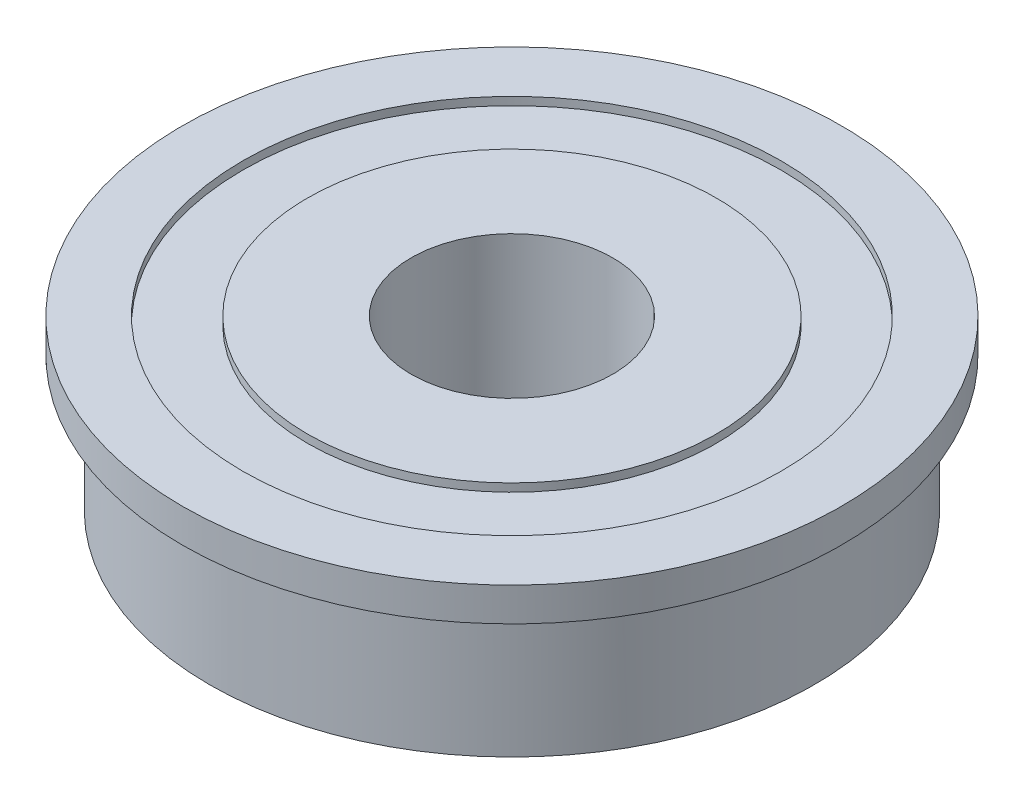
ISO-10303-21;
HEADER;
FILE_DESCRIPTION(('STEP AP214'),'2;1');
FILE_NAME('part.step','',(''),(''),'','','');
FILE_SCHEMA(('AUTOMOTIVE_DESIGN { 1 0 10303 214 1 1 1 1 }'));
ENDSEC;
DATA;
#1=APPLICATION_CONTEXT('core data for automotive mechanical design processes');
#2=APPLICATION_PROTOCOL_DEFINITION('international standard','automotive_design',2000,#1);
#3=PRODUCT_CONTEXT('',#1,'mechanical');
#4=PRODUCT('Part','Part','',(#3));
#5=PRODUCT_RELATED_PRODUCT_CATEGORY('part','',(#4));
#6=PRODUCT_DEFINITION_FORMATION('','',#4);
#7=PRODUCT_DEFINITION_CONTEXT('part definition',#1,'design');
#8=PRODUCT_DEFINITION('design','',#6,#7);
#9=PRODUCT_DEFINITION_SHAPE('','',#8);
#10=(LENGTH_UNIT() NAMED_UNIT(*) SI_UNIT(.MILLI.,.METRE.));
#11=(NAMED_UNIT(*) PLANE_ANGLE_UNIT() SI_UNIT($,.RADIAN.));
#12=(NAMED_UNIT(*) SI_UNIT($,.STERADIAN.) SOLID_ANGLE_UNIT());
#13=UNCERTAINTY_MEASURE_WITH_UNIT(LENGTH_MEASURE(1.E-05),#10,'distance_accuracy_value','');
#14=(GEOMETRIC_REPRESENTATION_CONTEXT(3) GLOBAL_UNCERTAINTY_ASSIGNED_CONTEXT((#13)) GLOBAL_UNIT_ASSIGNED_CONTEXT((#10,
#11,#12)) REPRESENTATION_CONTEXT('',''));
#15=CARTESIAN_POINT('',(0.,0.,0.));
#16=DIRECTION('',(0.,0.,1.));
#17=DIRECTION('',(1.,0.,0.));
#18=AXIS2_PLACEMENT_3D('',#15,#16,#17);
#19=CARTESIAN_POINT('',(0.,0.,0.));
#20=DIRECTION('',(0.,1.,0.));
#21=DIRECTION('',(0.,0.,1.));
#22=AXIS2_PLACEMENT_3D('',#19,#20,#21);
#23=CYLINDRICAL_SURFACE('',#22,12.7);
#24=CARTESIAN_POINT('',(0.,0.381,0.));
#25=DIRECTION('',(0.,1.,0.));
#26=DIRECTION('',(0.,0.,1.));
#27=AXIS2_PLACEMENT_3D('',#24,#25,#26);
#28=CIRCLE('',#27,12.7);
#29=CARTESIAN_POINT('',(0.,0.381,12.7));
#30=VERTEX_POINT('',#29);
#31=EDGE_CURVE('E137',#30,#30,#28,.F.);
#32=ORIENTED_EDGE('',*,*,#31,.F.);
#33=EDGE_LOOP('',(#32));
#34=FACE_BOUND('',#33,.T.);
#35=CARTESIAN_POINT('',(0.,0.,0.));
#36=DIRECTION('',(0.,1.,0.));
#37=DIRECTION('',(0.,0.,1.));
#38=AXIS2_PLACEMENT_3D('',#35,#36,#37);
#39=CIRCLE('',#38,12.7);
#40=CARTESIAN_POINT('',(0.,0.,12.7));
#41=VERTEX_POINT('',#40);
#42=EDGE_CURVE('E135',#41,#41,#39,.T.);
#43=ORIENTED_EDGE('',*,*,#42,.F.);
#44=EDGE_LOOP('',(#43));
#45=FACE_BOUND('',#44,.T.);
#46=ADVANCED_FACE('F38',(#34,#45),#23,.F.);
#47=CARTESIAN_POINT('',(9.652,0.381,0.));
#48=DIRECTION('',(0.,-1.,0.));
#49=DIRECTION('',(0.,0.,-1.));
#50=AXIS2_PLACEMENT_3D('',#47,#48,#49);
#51=PLANE('',#50);
#52=ORIENTED_EDGE('',*,*,#31,.T.);
#53=EDGE_LOOP('',(#52));
#54=FACE_BOUND('',#53,.T.);
#55=CARTESIAN_POINT('',(0.,0.381,0.));
#56=DIRECTION('',(0.,1.,0.));
#57=DIRECTION('',(0.,0.,1.));
#58=AXIS2_PLACEMENT_3D('',#55,#56,#57);
#59=CIRCLE('',#58,9.652);
#60=CARTESIAN_POINT('',(0.,0.381,9.652));
#61=VERTEX_POINT('',#60);
#62=EDGE_CURVE('E132',#61,#61,#59,.F.);
#63=ORIENTED_EDGE('',*,*,#62,.F.);
#64=EDGE_LOOP('',(#63));
#65=FACE_BOUND('',#64,.T.);
#66=ADVANCED_FACE('F272',(#54,#65),#51,.T.);
#67=CARTESIAN_POINT('',(14.2748,0.,0.));
#68=DIRECTION('',(0.,-1.,0.));
#69=DIRECTION('',(0.,0.,-1.));
#70=AXIS2_PLACEMENT_3D('',#67,#68,#69);
#71=PLANE('',#70);
#72=CARTESIAN_POINT('',(0.,0.,0.));
#73=DIRECTION('',(0.,1.,0.));
#74=DIRECTION('',(0.,0.,1.));
#75=AXIS2_PLACEMENT_3D('',#72,#73,#74);
#76=CIRCLE('',#75,14.2748);
#77=CARTESIAN_POINT('',(0.,0.,14.2748));
#78=VERTEX_POINT('',#77);
#79=EDGE_CURVE('E129',#78,#78,#76,.T.);
#80=ORIENTED_EDGE('',*,*,#79,.F.);
#81=EDGE_LOOP('',(#80));
#82=FACE_BOUND('',#81,.T.);
#83=ORIENTED_EDGE('',*,*,#42,.T.);
#84=EDGE_LOOP('',(#83));
#85=FACE_BOUND('',#84,.T.);
#86=ADVANCED_FACE('F261',(#82,#85),#71,.T.);
#87=CARTESIAN_POINT('',(0.,0.,0.));
#88=DIRECTION('',(0.,1.,0.));
#89=DIRECTION('',(0.,0.,1.));
#90=AXIS2_PLACEMENT_3D('',#87,#88,#89);
#91=CYLINDRICAL_SURFACE('',#90,9.652);
#92=CARTESIAN_POINT('',(0.,0.,0.));
#93=DIRECTION('',(0.,1.,0.));
#94=DIRECTION('',(0.,0.,1.));
#95=AXIS2_PLACEMENT_3D('',#92,#93,#94);
#96=CIRCLE('',#95,9.652);
#97=CARTESIAN_POINT('',(0.,0.,9.652));
#98=VERTEX_POINT('',#97);
#99=EDGE_CURVE('E113',#98,#98,#96,.F.);
#100=ORIENTED_EDGE('',*,*,#99,.F.);
#101=EDGE_LOOP('',(#100));
#102=FACE_BOUND('',#101,.T.);
#103=ORIENTED_EDGE('',*,*,#62,.T.);
#104=EDGE_LOOP('',(#103));
#105=FACE_BOUND('',#104,.T.);
#106=ADVANCED_FACE('F249',(#102,#105),#91,.T.);
#107=CARTESIAN_POINT('',(0.,0.,0.));
#108=DIRECTION('',(0.,1.,0.));
#109=DIRECTION('',(0.,0.,1.));
#110=AXIS2_PLACEMENT_3D('',#107,#108,#109);
#111=CYLINDRICAL_SURFACE('',#110,14.2748);
#112=ORIENTED_EDGE('',*,*,#79,.T.);
#113=EDGE_LOOP('',(#112));
#114=FACE_BOUND('',#113,.T.);
#115=CARTESIAN_POINT('',(0.,5.6,0.));
#116=DIRECTION('',(0.,-1.,0.));
#117=DIRECTION('',(0.,0.,-1.));
#118=AXIS2_PLACEMENT_3D('',#115,#116,#117);
#119=CIRCLE('',#118,14.2748);
#120=CARTESIAN_POINT('',(0.,5.6,-14.2748));
#121=VERTEX_POINT('',#120);
#122=EDGE_CURVE('E111',#121,#121,#119,.F.);
#123=ORIENTED_EDGE('',*,*,#122,.F.);
#124=EDGE_LOOP('',(#123));
#125=FACE_BOUND('',#124,.T.);
#126=ADVANCED_FACE('F244',(#114,#125),#111,.T.);
#127=CARTESIAN_POINT('',(9.652,0.,0.));
#128=DIRECTION('',(0.,-1.,0.));
#129=DIRECTION('',(0.,0.,-1.));
#130=AXIS2_PLACEMENT_3D('',#127,#128,#129);
#131=PLANE('',#130);
#132=CARTESIAN_POINT('',(0.,0.,0.));
#133=DIRECTION('',(0.,1.,0.));
#134=DIRECTION('',(0.,0.,1.));
#135=AXIS2_PLACEMENT_3D('',#132,#133,#134);
#136=CIRCLE('',#135,4.7625);
#137=CARTESIAN_POINT('',(0.,0.,4.7625));
#138=VERTEX_POINT('',#137);
#139=EDGE_CURVE('E139',#138,#138,#136,.T.);
#140=ORIENTED_EDGE('',*,*,#139,.T.);
#141=EDGE_LOOP('',(#140));
#142=FACE_BOUND('',#141,.T.);
#143=ORIENTED_EDGE('',*,*,#99,.T.);
#144=EDGE_LOOP('',(#143));
#145=FACE_BOUND('',#144,.T.);
#146=ADVANCED_FACE('F161',(#142,#145),#131,.T.);
#147=CARTESIAN_POINT('',(0.,5.6,0.));
#148=DIRECTION('',(0.,-1.,0.));
#149=DIRECTION('',(0.,0.,-1.));
#150=AXIS2_PLACEMENT_3D('',#147,#148,#149);
#151=CONICAL_SURFACE('',#150,14.2748,0.523598775598298);
#152=CARTESIAN_POINT('',(0.,5.975,0.));
#153=DIRECTION('',(0.,1.,0.));
#154=DIRECTION('',(0.,0.,1.));
#155=AXIS2_PLACEMENT_3D('',#152,#153,#154);
#156=CIRCLE('',#155,14.0582936490539);
#157=CARTESIAN_POINT('',(0.,5.975,14.0582936490539));
#158=VERTEX_POINT('',#157);
#159=EDGE_CURVE('E103',#158,#158,#156,.F.);
#160=ORIENTED_EDGE('',*,*,#159,.T.);
#161=EDGE_LOOP('',(#160));
#162=FACE_BOUND('',#161,.T.);
#163=ORIENTED_EDGE('',*,*,#122,.T.);
#164=EDGE_LOOP('',(#163));
#165=FACE_BOUND('',#164,.T.);
#166=ADVANCED_FACE('F155',(#162,#165),#151,.T.);
#167=CARTESIAN_POINT('',(6.35,7.9375,0.));
#168=DIRECTION('',(0.,1.,0.));
#169=DIRECTION('',(0.,0.,1.));
#170=AXIS2_PLACEMENT_3D('',#167,#168,#169);
#171=PLANE('',#170);
#172=CARTESIAN_POINT('',(0.,7.9375,0.));
#173=DIRECTION('',(0.,1.,0.));
#174=DIRECTION('',(0.,0.,1.));
#175=AXIS2_PLACEMENT_3D('',#172,#173,#174);
#176=CIRCLE('',#175,4.7625);
#177=CARTESIAN_POINT('',(0.,7.9375,4.7625));
#178=VERTEX_POINT('',#177);
#179=EDGE_CURVE('E143',#178,#178,#176,.T.);
#180=ORIENTED_EDGE('',*,*,#179,.F.);
#181=EDGE_LOOP('',(#180));
#182=FACE_BOUND('',#181,.T.);
#183=CARTESIAN_POINT('',(0.,7.9375,0.));
#184=DIRECTION('',(0.,1.,0.));
#185=DIRECTION('',(0.,0.,1.));
#186=AXIS2_PLACEMENT_3D('',#183,#184,#185);
#187=CIRCLE('',#186,9.652);
#188=CARTESIAN_POINT('',(0.,7.9375,9.652));
#189=VERTEX_POINT('',#188);
#190=EDGE_CURVE('E62',#189,#189,#187,.F.);
#191=ORIENTED_EDGE('',*,*,#190,.F.);
#192=EDGE_LOOP('',(#191));
#193=FACE_BOUND('',#192,.T.);
#194=ADVANCED_FACE('F95',(#182,#193),#171,.T.);
#195=CARTESIAN_POINT('',(0.,6.1,0.));
#196=DIRECTION('',(0.,1.,0.));
#197=DIRECTION('',(0.,0.,1.));
#198=AXIS2_PLACEMENT_3D('',#195,#196,#197);
#199=TOROIDAL_SURFACE('',#198,14.2748,0.25);
#200=ORIENTED_EDGE('',*,*,#159,.F.);
#201=EDGE_LOOP('',(#200));
#202=FACE_BOUND('',#201,.T.);
#203=CARTESIAN_POINT('',(0.,6.35,0.));
#204=DIRECTION('',(0.,-1.,0.));
#205=DIRECTION('',(0.,0.,-1.));
#206=AXIS2_PLACEMENT_3D('',#203,#204,#205);
#207=CIRCLE('',#206,14.2748);
#208=CARTESIAN_POINT('',(0.,6.35,14.2748));
#209=VERTEX_POINT('',#208);
#210=CARTESIAN_POINT('',(0.,6.35,-14.2748));
#211=VERTEX_POINT('',#210);
#212=EDGE_CURVE('E58',#209,#211,#207,.F.);
#213=ORIENTED_EDGE('',*,*,#212,.F.);
#214=CARTESIAN_POINT('',(0.,6.35,0.));
#215=DIRECTION('',(0.,-1.,0.));
#216=DIRECTION('',(0.,0.,1.));
#217=AXIS2_PLACEMENT_3D('',#214,#215,#216);
#218=CIRCLE('',#217,14.2748);
#219=EDGE_CURVE('E55',#211,#209,#218,.F.);
#220=ORIENTED_EDGE('',*,*,#219,.F.);
#221=EDGE_LOOP('',(#213,#220));
#222=FACE_BOUND('',#221,.T.);
#223=ADVANCED_FACE('F59',(#202,#222),#199,.F.);
#224=CARTESIAN_POINT('',(0.,0.,0.));
#225=DIRECTION('',(0.,1.,0.));
#226=DIRECTION('',(0.,0.,1.));
#227=AXIS2_PLACEMENT_3D('',#224,#225,#226);
#228=CYLINDRICAL_SURFACE('',#227,9.652);
#229=CARTESIAN_POINT('',(0.,7.5565,0.));
#230=DIRECTION('',(0.,1.,0.));
#231=DIRECTION('',(0.,0.,1.));
#232=AXIS2_PLACEMENT_3D('',#229,#230,#231);
#233=CIRCLE('',#232,9.652);
#234=CARTESIAN_POINT('',(0.,7.5565,9.652));
#235=VERTEX_POINT('',#234);
#236=EDGE_CURVE('E66',#235,#235,#233,.F.);
#237=ORIENTED_EDGE('',*,*,#236,.F.);
#238=EDGE_LOOP('',(#237));
#239=FACE_BOUND('',#238,.T.);
#240=ORIENTED_EDGE('',*,*,#190,.T.);
#241=EDGE_LOOP('',(#240));
#242=FACE_BOUND('',#241,.T.);
#243=ADVANCED_FACE('F86',(#239,#242),#228,.T.);
#244=CARTESIAN_POINT('',(15.5575,6.35,0.));
#245=DIRECTION('',(0.,-1.,0.));
#246=DIRECTION('',(0.,0.,-1.));
#247=AXIS2_PLACEMENT_3D('',#244,#245,#246);
#248=PLANE('',#247);
#249=CARTESIAN_POINT('',(0.,6.35,0.));
#250=DIRECTION('',(0.,1.,0.));
#251=DIRECTION('',(0.,0.,1.));
#252=AXIS2_PLACEMENT_3D('',#249,#250,#251);
#253=CIRCLE('',#252,15.5575);
#254=CARTESIAN_POINT('',(0.,6.35,15.5575));
#255=VERTEX_POINT('',#254);
#256=EDGE_CURVE('E120',#255,#255,#253,.T.);
#257=ORIENTED_EDGE('',*,*,#256,.F.);
#258=EDGE_LOOP('',(#257));
#259=FACE_BOUND('',#258,.T.);
#260=ORIENTED_EDGE('',*,*,#212,.T.);
#261=ORIENTED_EDGE('',*,*,#219,.T.);
#262=EDGE_LOOP('',(#260,#261));
#263=FACE_BOUND('',#262,.T.);
#264=ADVANCED_FACE('F65',(#259,#263),#248,.T.);
#265=CARTESIAN_POINT('',(9.652,7.5565,0.));
#266=DIRECTION('',(0.,1.,0.));
#267=DIRECTION('',(0.,0.,1.));
#268=AXIS2_PLACEMENT_3D('',#265,#266,#267);
#269=PLANE('',#268);
#270=ORIENTED_EDGE('',*,*,#236,.T.);
#271=EDGE_LOOP('',(#270));
#272=FACE_BOUND('',#271,.T.);
#273=CARTESIAN_POINT('',(0.,7.5565,0.));
#274=DIRECTION('',(0.,1.,0.));
#275=DIRECTION('',(0.,0.,1.));
#276=AXIS2_PLACEMENT_3D('',#273,#274,#275);
#277=CIRCLE('',#276,12.7);
#278=CARTESIAN_POINT('',(0.,7.5565,12.7));
#279=VERTEX_POINT('',#278);
#280=EDGE_CURVE('E117',#279,#279,#277,.T.);
#281=ORIENTED_EDGE('',*,*,#280,.T.);
#282=EDGE_LOOP('',(#281));
#283=FACE_BOUND('',#282,.T.);
#284=ADVANCED_FACE('F85',(#272,#283),#269,.T.);
#285=CARTESIAN_POINT('',(0.,0.,0.));
#286=DIRECTION('',(0.,1.,0.));
#287=DIRECTION('',(0.,0.,1.));
#288=AXIS2_PLACEMENT_3D('',#285,#286,#287);
#289=CYLINDRICAL_SURFACE('',#288,15.5575);
#290=ORIENTED_EDGE('',*,*,#256,.T.);
#291=EDGE_LOOP('',(#290));
#292=FACE_BOUND('',#291,.T.);
#293=CARTESIAN_POINT('',(0.,7.9375,0.));
#294=DIRECTION('',(0.,1.,0.));
#295=DIRECTION('',(0.,0.,1.));
#296=AXIS2_PLACEMENT_3D('',#293,#294,#295);
#297=CIRCLE('',#296,15.5575);
#298=CARTESIAN_POINT('',(0.,7.9375,15.5575));
#299=VERTEX_POINT('',#298);
#300=EDGE_CURVE('E49',#299,#299,#297,.T.);
#301=ORIENTED_EDGE('',*,*,#300,.F.);
#302=EDGE_LOOP('',(#301));
#303=FACE_BOUND('',#302,.T.);
#304=ADVANCED_FACE('F174',(#292,#303),#289,.T.);
#305=CARTESIAN_POINT('',(0.,0.,0.));
#306=DIRECTION('',(0.,1.,0.));
#307=DIRECTION('',(0.,0.,1.));
#308=AXIS2_PLACEMENT_3D('',#305,#306,#307);
#309=CYLINDRICAL_SURFACE('',#308,12.7);
#310=CARTESIAN_POINT('',(0.,7.9375,0.));
#311=DIRECTION('',(0.,1.,0.));
#312=DIRECTION('',(0.,0.,1.));
#313=AXIS2_PLACEMENT_3D('',#310,#311,#312);
#314=CIRCLE('',#313,12.7);
#315=CARTESIAN_POINT('',(0.,7.9375,12.7));
#316=VERTEX_POINT('',#315);
#317=EDGE_CURVE('E11',#316,#316,#314,.F.);
#318=ORIENTED_EDGE('',*,*,#317,.F.);
#319=EDGE_LOOP('',(#318));
#320=FACE_BOUND('',#319,.T.);
#321=ORIENTED_EDGE('',*,*,#280,.F.);
#322=EDGE_LOOP('',(#321));
#323=FACE_BOUND('',#322,.T.);
#324=ADVANCED_FACE('F165',(#320,#323),#309,.F.);
#325=CARTESIAN_POINT('',(12.7,7.9375,0.));
#326=DIRECTION('',(0.,1.,0.));
#327=DIRECTION('',(0.,0.,1.));
#328=AXIS2_PLACEMENT_3D('',#325,#326,#327);
#329=PLANE('',#328);
#330=ORIENTED_EDGE('',*,*,#317,.T.);
#331=EDGE_LOOP('',(#330));
#332=FACE_BOUND('',#331,.T.);
#333=ORIENTED_EDGE('',*,*,#300,.T.);
#334=EDGE_LOOP('',(#333));
#335=FACE_BOUND('',#334,.T.);
#336=ADVANCED_FACE('F163',(#332,#335),#329,.T.);
#337=CARTESIAN_POINT('',(0.,0.,0.));
#338=DIRECTION('',(0.,1.,0.));
#339=DIRECTION('',(0.,0.,1.));
#340=AXIS2_PLACEMENT_3D('',#337,#338,#339);
#341=CYLINDRICAL_SURFACE('',#340,4.7625);
#342=ORIENTED_EDGE('',*,*,#139,.F.);
#343=EDGE_LOOP('',(#342));
#344=FACE_BOUND('',#343,.T.);
#345=ORIENTED_EDGE('',*,*,#179,.T.);
#346=EDGE_LOOP('',(#345));
#347=FACE_BOUND('',#346,.T.);
#348=ADVANCED_FACE('F151',(#344,#347),#341,.F.);
#349=CLOSED_SHELL('',(#46,#66,#86,#106,#126,#146,#166,#194,#223,#243,#264,#284,#304,#324,#336,#348));
#350=MANIFOLD_SOLID_BREP('B2',#349);
#351=ADVANCED_BREP_SHAPE_REPRESENTATION('',(#18,#350),#14);
#352=SHAPE_DEFINITION_REPRESENTATION(#9,#351);
ENDSEC;
END-ISO-10303-21;
